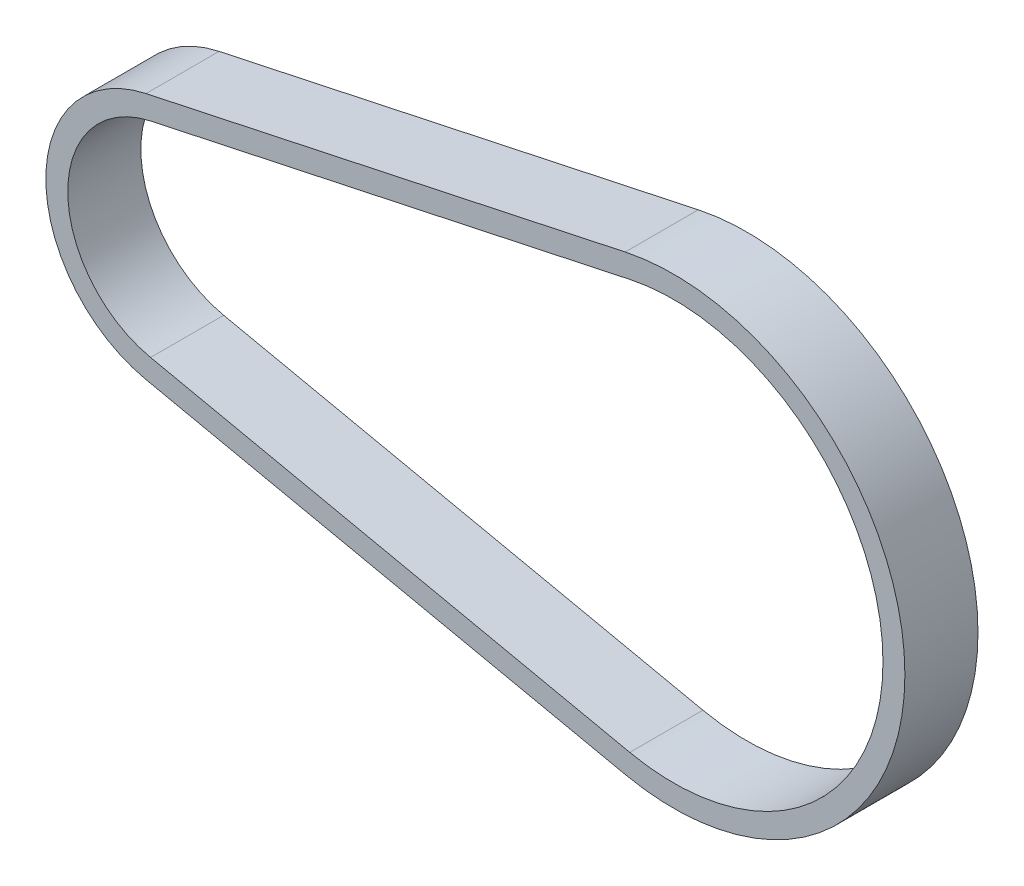
ISO-10303-21;
HEADER;
FILE_DESCRIPTION(('STEP AP214'),'2;1');
FILE_NAME('part.step','',(''),(''),'','','');
FILE_SCHEMA(('AUTOMOTIVE_DESIGN { 1 0 10303 214 1 1 1 1 }'));
ENDSEC;
DATA;
#1=APPLICATION_CONTEXT('core data for automotive mechanical design processes');
#2=APPLICATION_PROTOCOL_DEFINITION('international standard','automotive_design',2000,#1);
#3=PRODUCT_CONTEXT('',#1,'mechanical');
#4=PRODUCT('Part','Part','',(#3));
#5=PRODUCT_RELATED_PRODUCT_CATEGORY('part','',(#4));
#6=PRODUCT_DEFINITION_FORMATION('','',#4);
#7=PRODUCT_DEFINITION_CONTEXT('part definition',#1,'design');
#8=PRODUCT_DEFINITION('design','',#6,#7);
#9=PRODUCT_DEFINITION_SHAPE('','',#8);
#10=(LENGTH_UNIT() NAMED_UNIT(*) SI_UNIT(.MILLI.,.METRE.));
#11=(NAMED_UNIT(*) PLANE_ANGLE_UNIT() SI_UNIT($,.RADIAN.));
#12=(NAMED_UNIT(*) SI_UNIT($,.STERADIAN.) SOLID_ANGLE_UNIT());
#13=UNCERTAINTY_MEASURE_WITH_UNIT(LENGTH_MEASURE(1.E-05),#10,'distance_accuracy_value','');
#14=(GEOMETRIC_REPRESENTATION_CONTEXT(3) GLOBAL_UNCERTAINTY_ASSIGNED_CONTEXT((#13)) GLOBAL_UNIT_ASSIGNED_CONTEXT((#10,
#11,#12)) REPRESENTATION_CONTEXT('',''));
#15=CARTESIAN_POINT('',(0.,0.,0.));
#16=DIRECTION('',(0.,0.,1.));
#17=DIRECTION('',(1.,0.,0.));
#18=AXIS2_PLACEMENT_3D('',#15,#16,#17);
#19=CARTESIAN_POINT('',(-34.275,0.,5.));
#20=DIRECTION('',(0.,0.,1.));
#21=DIRECTION('',(1.,0.,0.));
#22=AXIS2_PLACEMENT_3D('',#19,#20,#21);
#23=PLANE('',#22);
#24=CARTESIAN_POINT('',(-34.275,0.,5.));
#25=DIRECTION('',(0.,0.,1.));
#26=DIRECTION('',(1.,0.,0.));
#27=AXIS2_PLACEMENT_3D('',#24,#25,#26);
#28=CIRCLE('',#27,17.325);
#29=CARTESIAN_POINT('',(-37.895432166302,16.9424937930992,5.));
#30=VERTEX_POINT('',#29);
#31=CARTESIAN_POINT('',(-37.895432166302,-16.9424937930992,5.));
#32=VERTEX_POINT('',#31);
#33=EDGE_CURVE('E153',#30,#32,#28,.T.);
#34=ORIENTED_EDGE('',*,*,#33,.T.);
#35=DIRECTION('',(0.977921719659407,-0.208971553610503,0.));
#36=VECTOR('',#35,1.);
#37=CARTESIAN_POINT('',(-37.895432166302,-16.9424937930992,5.));
#38=LINE('',#37,#36);
#39=CARTESIAN_POINT('',(27.6610503282276,-30.9512224272202,5.));
#40=VERTEX_POINT('',#39);
#41=EDGE_CURVE('E157',#32,#40,#38,.T.);
#42=ORIENTED_EDGE('',*,*,#41,.T.);
#43=CARTESIAN_POINT('',(34.275,0.,5.));
#44=DIRECTION('',(0.,0.,1.));
#45=DIRECTION('',(1.,0.,0.));
#46=AXIS2_PLACEMENT_3D('',#43,#44,#45);
#47=CIRCLE('',#46,31.65);
#48=CARTESIAN_POINT('',(27.6610503282276,30.9512224272202,5.));
#49=VERTEX_POINT('',#48);
#50=EDGE_CURVE('E161',#40,#49,#47,.T.);
#51=ORIENTED_EDGE('',*,*,#50,.T.);
#52=DIRECTION('',(-0.977921719659407,-0.208971553610503,0.));
#53=VECTOR('',#52,1.);
#54=CARTESIAN_POINT('',(-37.895432166302,16.9424937930992,5.));
#55=LINE('',#54,#53);
#56=EDGE_CURVE('E164',#49,#30,#55,.T.);
#57=ORIENTED_EDGE('',*,*,#56,.T.);
#58=EDGE_LOOP('',(#34,#42,#51,#57));
#59=FACE_BOUND('',#58,.T.);
#60=DIRECTION('',(-0.977921719659407,-0.208971553610503,0.));
#61=VECTOR('',#60,1.);
#62=CARTESIAN_POINT('',(-37.2685175054705,14.008728634121,5.));
#63=LINE('',#62,#61);
#64=CARTESIAN_POINT('',(28.2879649890591,28.017457268242,5.));
#65=VERTEX_POINT('',#64);
#66=CARTESIAN_POINT('',(-37.2685175054705,14.008728634121,5.));
#67=VERTEX_POINT('',#66);
#68=EDGE_CURVE('E114',#65,#67,#63,.T.);
#69=ORIENTED_EDGE('',*,*,#68,.F.);
#70=CARTESIAN_POINT('',(34.275,0.,5.));
#71=DIRECTION('',(0.,0.,1.));
#72=DIRECTION('',(1.,0.,0.));
#73=AXIS2_PLACEMENT_3D('',#70,#71,#72);
#74=CIRCLE('',#73,28.65);
#75=CARTESIAN_POINT('',(28.2879649890591,-28.017457268242,5.));
#76=VERTEX_POINT('',#75);
#77=EDGE_CURVE('E105',#76,#65,#74,.T.);
#78=ORIENTED_EDGE('',*,*,#77,.F.);
#79=DIRECTION('',(0.977921719659407,-0.208971553610503,0.));
#80=VECTOR('',#79,1.);
#81=CARTESIAN_POINT('',(-37.2685175054705,-14.008728634121,5.));
#82=LINE('',#81,#80);
#83=CARTESIAN_POINT('',(-37.2685175054705,-14.008728634121,5.));
#84=VERTEX_POINT('',#83);
#85=EDGE_CURVE('E131',#84,#76,#82,.T.);
#86=ORIENTED_EDGE('',*,*,#85,.F.);
#87=CARTESIAN_POINT('',(-34.275,0.,5.));
#88=DIRECTION('',(0.,0.,1.));
#89=DIRECTION('',(1.,0.,0.));
#90=AXIS2_PLACEMENT_3D('',#87,#88,#89);
#91=CIRCLE('',#90,14.325);
#92=EDGE_CURVE('E127',#67,#84,#91,.T.);
#93=ORIENTED_EDGE('',*,*,#92,.F.);
#94=EDGE_LOOP('',(#69,#78,#86,#93));
#95=FACE_BOUND('',#94,.T.);
#96=ADVANCED_FACE('F39',(#59,#95),#23,.T.);
#97=CARTESIAN_POINT('',(-34.275,0.,-5.));
#98=DIRECTION('',(0.,0.,1.));
#99=DIRECTION('',(1.,0.,0.));
#100=AXIS2_PLACEMENT_3D('',#97,#98,#99);
#101=PLANE('',#100);
#102=CARTESIAN_POINT('',(-34.275,0.,-5.));
#103=DIRECTION('',(0.,0.,1.));
#104=DIRECTION('',(1.,0.,0.));
#105=AXIS2_PLACEMENT_3D('',#102,#103,#104);
#106=CIRCLE('',#105,17.325);
#107=CARTESIAN_POINT('',(-37.895432166302,16.9424937930992,-5.));
#108=VERTEX_POINT('',#107);
#109=CARTESIAN_POINT('',(-37.895432166302,-16.9424937930992,-5.));
#110=VERTEX_POINT('',#109);
#111=EDGE_CURVE('E123',#108,#110,#106,.T.);
#112=ORIENTED_EDGE('',*,*,#111,.F.);
#113=DIRECTION('',(-0.977921719659407,-0.208971553610503,0.));
#114=VECTOR('',#113,1.);
#115=CARTESIAN_POINT('',(-37.895432166302,16.9424937930992,-5.));
#116=LINE('',#115,#114);
#117=CARTESIAN_POINT('',(27.6610503282276,30.9512224272202,-5.));
#118=VERTEX_POINT('',#117);
#119=EDGE_CURVE('E158',#118,#108,#116,.T.);
#120=ORIENTED_EDGE('',*,*,#119,.F.);
#121=CARTESIAN_POINT('',(34.275,0.,-5.));
#122=DIRECTION('',(0.,0.,1.));
#123=DIRECTION('',(1.,0.,0.));
#124=AXIS2_PLACEMENT_3D('',#121,#122,#123);
#125=CIRCLE('',#124,31.65);
#126=CARTESIAN_POINT('',(27.6610503282276,-30.9512224272202,-5.));
#127=VERTEX_POINT('',#126);
#128=EDGE_CURVE('E174',#127,#118,#125,.T.);
#129=ORIENTED_EDGE('',*,*,#128,.F.);
#130=DIRECTION('',(0.977921719659407,-0.208971553610503,0.));
#131=VECTOR('',#130,1.);
#132=CARTESIAN_POINT('',(-37.895432166302,-16.9424937930992,-5.));
#133=LINE('',#132,#131);
#134=EDGE_CURVE('E171',#110,#127,#133,.T.);
#135=ORIENTED_EDGE('',*,*,#134,.F.);
#136=EDGE_LOOP('',(#112,#120,#129,#135));
#137=FACE_BOUND('',#136,.T.);
#138=CARTESIAN_POINT('',(34.275,0.,-5.));
#139=DIRECTION('',(0.,0.,1.));
#140=DIRECTION('',(1.,0.,0.));
#141=AXIS2_PLACEMENT_3D('',#138,#139,#140);
#142=CIRCLE('',#141,28.65);
#143=CARTESIAN_POINT('',(28.2879649890591,-28.017457268242,-5.));
#144=VERTEX_POINT('',#143);
#145=CARTESIAN_POINT('',(28.2879649890591,28.017457268242,-5.));
#146=VERTEX_POINT('',#145);
#147=EDGE_CURVE('E63',#144,#146,#142,.T.);
#148=ORIENTED_EDGE('',*,*,#147,.T.);
#149=DIRECTION('',(-0.977921719659407,-0.208971553610503,0.));
#150=VECTOR('',#149,1.);
#151=CARTESIAN_POINT('',(-37.2685175054705,14.008728634121,-5.));
#152=LINE('',#151,#150);
#153=CARTESIAN_POINT('',(-37.2685175054705,14.008728634121,-5.));
#154=VERTEX_POINT('',#153);
#155=EDGE_CURVE('E121',#146,#154,#152,.T.);
#156=ORIENTED_EDGE('',*,*,#155,.T.);
#157=CARTESIAN_POINT('',(-34.275,0.,-5.));
#158=DIRECTION('',(0.,0.,1.));
#159=DIRECTION('',(1.,0.,0.));
#160=AXIS2_PLACEMENT_3D('',#157,#158,#159);
#161=CIRCLE('',#160,14.325);
#162=CARTESIAN_POINT('',(-37.2685175054705,-14.008728634121,-5.));
#163=VERTEX_POINT('',#162);
#164=EDGE_CURVE('E140',#154,#163,#161,.T.);
#165=ORIENTED_EDGE('',*,*,#164,.T.);
#166=DIRECTION('',(0.977921719659407,-0.208971553610503,0.));
#167=VECTOR('',#166,1.);
#168=CARTESIAN_POINT('',(-37.2685175054705,-14.008728634121,-5.));
#169=LINE('',#168,#167);
#170=EDGE_CURVE('E115',#163,#144,#169,.T.);
#171=ORIENTED_EDGE('',*,*,#170,.T.);
#172=EDGE_LOOP('',(#148,#156,#165,#171));
#173=FACE_BOUND('',#172,.T.);
#174=ADVANCED_FACE('F197',(#137,#173),#101,.F.);
#175=CARTESIAN_POINT('',(-34.275,0.,5.));
#176=DIRECTION('',(0.,0.,-1.));
#177=DIRECTION('',(-1.,0.,0.));
#178=AXIS2_PLACEMENT_3D('',#175,#176,#177);
#179=CYLINDRICAL_SURFACE('',#178,17.325);
#180=ORIENTED_EDGE('',*,*,#111,.T.);
#181=DIRECTION('',(0.,0.,-1.));
#182=VECTOR('',#181,1.);
#183=CARTESIAN_POINT('',(-37.895432166302,-16.9424937930992,5.));
#184=LINE('',#183,#182);
#185=EDGE_CURVE('E11',#32,#110,#184,.T.);
#186=ORIENTED_EDGE('',*,*,#185,.F.);
#187=ORIENTED_EDGE('',*,*,#33,.F.);
#188=DIRECTION('',(0.,0.,-1.));
#189=VECTOR('',#188,1.);
#190=CARTESIAN_POINT('',(-37.895432166302,16.9424937930992,5.));
#191=LINE('',#190,#189);
#192=EDGE_CURVE('E167',#30,#108,#191,.T.);
#193=ORIENTED_EDGE('',*,*,#192,.T.);
#194=EDGE_LOOP('',(#180,#186,#187,#193));
#195=FACE_BOUND('',#194,.T.);
#196=ADVANCED_FACE('F41',(#195),#179,.T.);
#197=CARTESIAN_POINT('',(-37.895432166302,-16.9424937930992,5.));
#198=DIRECTION('',(0.208971553610503,0.977921719659407,0.));
#199=DIRECTION('',(-0.977921719659407,0.208971553610503,0.));
#200=AXIS2_PLACEMENT_3D('',#197,#198,#199);
#201=PLANE('',#200);
#202=ORIENTED_EDGE('',*,*,#134,.T.);
#203=DIRECTION('',(0.,0.,-1.));
#204=VECTOR('',#203,1.);
#205=CARTESIAN_POINT('',(27.6610503282276,-30.9512224272202,5.));
#206=LINE('',#205,#204);
#207=EDGE_CURVE('E48',#40,#127,#206,.T.);
#208=ORIENTED_EDGE('',*,*,#207,.F.);
#209=ORIENTED_EDGE('',*,*,#41,.F.);
#210=ORIENTED_EDGE('',*,*,#185,.T.);
#211=EDGE_LOOP('',(#202,#208,#209,#210));
#212=FACE_BOUND('',#211,.T.);
#213=ADVANCED_FACE('F207',(#212),#201,.F.);
#214=CARTESIAN_POINT('',(34.275,0.,5.));
#215=DIRECTION('',(0.,0.,-1.));
#216=DIRECTION('',(-1.,0.,0.));
#217=AXIS2_PLACEMENT_3D('',#214,#215,#216);
#218=CYLINDRICAL_SURFACE('',#217,31.65);
#219=ORIENTED_EDGE('',*,*,#128,.T.);
#220=DIRECTION('',(0.,0.,-1.));
#221=VECTOR('',#220,1.);
#222=CARTESIAN_POINT('',(27.6610503282276,30.9512224272202,5.));
#223=LINE('',#222,#221);
#224=EDGE_CURVE('E182',#49,#118,#223,.T.);
#225=ORIENTED_EDGE('',*,*,#224,.F.);
#226=ORIENTED_EDGE('',*,*,#50,.F.);
#227=ORIENTED_EDGE('',*,*,#207,.T.);
#228=EDGE_LOOP('',(#219,#225,#226,#227));
#229=FACE_BOUND('',#228,.T.);
#230=ADVANCED_FACE('F191',(#229),#218,.T.);
#231=CARTESIAN_POINT('',(-37.895432166302,16.9424937930992,5.));
#232=DIRECTION('',(0.208971553610503,-0.977921719659407,0.));
#233=DIRECTION('',(0.977921719659407,0.208971553610503,0.));
#234=AXIS2_PLACEMENT_3D('',#231,#232,#233);
#235=PLANE('',#234);
#236=ORIENTED_EDGE('',*,*,#119,.T.);
#237=ORIENTED_EDGE('',*,*,#192,.F.);
#238=ORIENTED_EDGE('',*,*,#56,.F.);
#239=ORIENTED_EDGE('',*,*,#224,.T.);
#240=EDGE_LOOP('',(#236,#237,#238,#239));
#241=FACE_BOUND('',#240,.T.);
#242=ADVANCED_FACE('F201',(#241),#235,.F.);
#243=CARTESIAN_POINT('',(34.275,0.,5.));
#244=DIRECTION('',(0.,0.,-1.));
#245=DIRECTION('',(-1.,0.,0.));
#246=AXIS2_PLACEMENT_3D('',#243,#244,#245);
#247=CYLINDRICAL_SURFACE('',#246,28.65);
#248=ORIENTED_EDGE('',*,*,#147,.F.);
#249=DIRECTION('',(0.,0.,-1.));
#250=VECTOR('',#249,1.);
#251=CARTESIAN_POINT('',(28.2879649890591,-28.017457268242,5.));
#252=LINE('',#251,#250);
#253=EDGE_CURVE('E109',#76,#144,#252,.T.);
#254=ORIENTED_EDGE('',*,*,#253,.F.);
#255=ORIENTED_EDGE('',*,*,#77,.T.);
#256=DIRECTION('',(0.,0.,-1.));
#257=VECTOR('',#256,1.);
#258=CARTESIAN_POINT('',(28.2879649890591,28.017457268242,5.));
#259=LINE('',#258,#257);
#260=EDGE_CURVE('E108',#65,#146,#259,.T.);
#261=ORIENTED_EDGE('',*,*,#260,.T.);
#262=EDGE_LOOP('',(#248,#254,#255,#261));
#263=FACE_BOUND('',#262,.T.);
#264=ADVANCED_FACE('F107',(#263),#247,.F.);
#265=CARTESIAN_POINT('',(-37.2685175054705,14.008728634121,5.));
#266=DIRECTION('',(0.208971553610503,-0.977921719659407,0.));
#267=DIRECTION('',(0.977921719659407,0.208971553610503,0.));
#268=AXIS2_PLACEMENT_3D('',#265,#266,#267);
#269=PLANE('',#268);
#270=ORIENTED_EDGE('',*,*,#155,.F.);
#271=ORIENTED_EDGE('',*,*,#260,.F.);
#272=ORIENTED_EDGE('',*,*,#68,.T.);
#273=DIRECTION('',(0.,0.,-1.));
#274=VECTOR('',#273,1.);
#275=CARTESIAN_POINT('',(-37.2685175054705,14.008728634121,5.));
#276=LINE('',#275,#274);
#277=EDGE_CURVE('E124',#67,#154,#276,.T.);
#278=ORIENTED_EDGE('',*,*,#277,.T.);
#279=EDGE_LOOP('',(#270,#271,#272,#278));
#280=FACE_BOUND('',#279,.T.);
#281=ADVANCED_FACE('F118',(#280),#269,.T.);
#282=CARTESIAN_POINT('',(-34.275,0.,5.));
#283=DIRECTION('',(0.,0.,-1.));
#284=DIRECTION('',(-1.,0.,0.));
#285=AXIS2_PLACEMENT_3D('',#282,#283,#284);
#286=CYLINDRICAL_SURFACE('',#285,14.325);
#287=ORIENTED_EDGE('',*,*,#164,.F.);
#288=ORIENTED_EDGE('',*,*,#277,.F.);
#289=ORIENTED_EDGE('',*,*,#92,.T.);
#290=DIRECTION('',(0.,0.,-1.));
#291=VECTOR('',#290,1.);
#292=CARTESIAN_POINT('',(-37.2685175054705,-14.008728634121,5.));
#293=LINE('',#292,#291);
#294=EDGE_CURVE('E55',#84,#163,#293,.T.);
#295=ORIENTED_EDGE('',*,*,#294,.T.);
#296=EDGE_LOOP('',(#287,#288,#289,#295));
#297=FACE_BOUND('',#296,.T.);
#298=ADVANCED_FACE('F230',(#297),#286,.F.);
#299=CARTESIAN_POINT('',(-37.2685175054705,-14.008728634121,5.));
#300=DIRECTION('',(0.208971553610503,0.977921719659407,0.));
#301=DIRECTION('',(-0.977921719659407,0.208971553610503,0.));
#302=AXIS2_PLACEMENT_3D('',#299,#300,#301);
#303=PLANE('',#302);
#304=ORIENTED_EDGE('',*,*,#170,.F.);
#305=ORIENTED_EDGE('',*,*,#294,.F.);
#306=ORIENTED_EDGE('',*,*,#85,.T.);
#307=ORIENTED_EDGE('',*,*,#253,.T.);
#308=EDGE_LOOP('',(#304,#305,#306,#307));
#309=FACE_BOUND('',#308,.T.);
#310=ADVANCED_FACE('F234',(#309),#303,.T.);
#311=CLOSED_SHELL('',(#96,#174,#196,#213,#230,#242,#264,#281,#298,#310));
#312=MANIFOLD_SOLID_BREP('B2',#311);
#313=ADVANCED_BREP_SHAPE_REPRESENTATION('',(#18,#312),#14);
#314=SHAPE_DEFINITION_REPRESENTATION(#9,#313);
ENDSEC;
END-ISO-10303-21;
